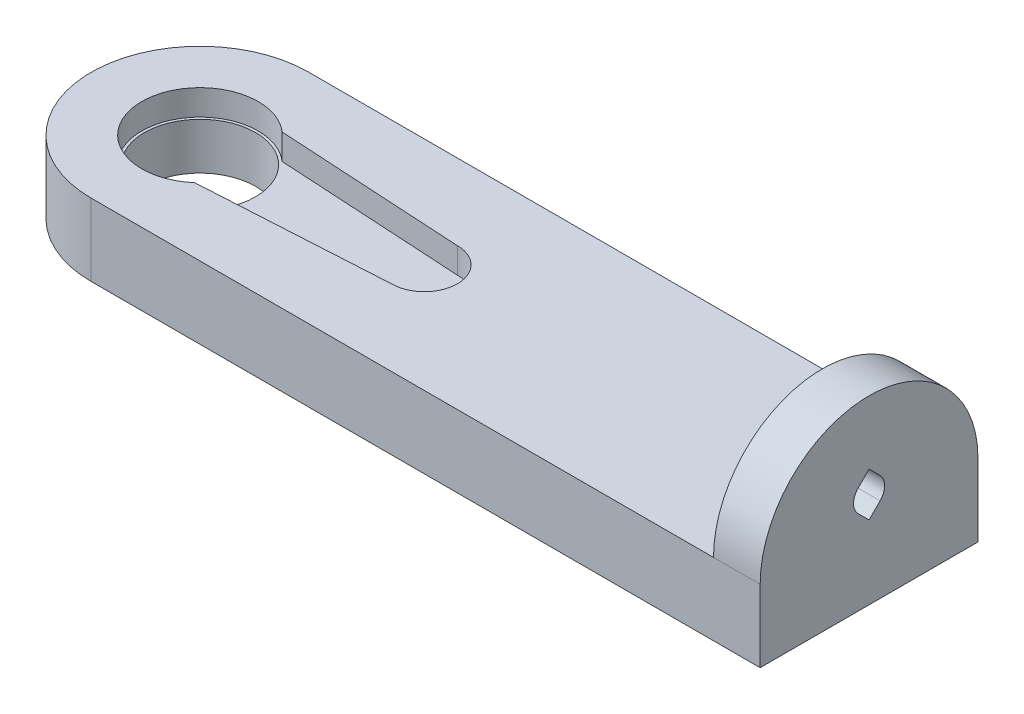
ISO-10303-21;
HEADER;
FILE_DESCRIPTION(('STEP AP214'),'2;1');
FILE_NAME('part.step','',(''),(''),'','','');
FILE_SCHEMA(('AUTOMOTIVE_DESIGN { 1 0 10303 214 1 1 1 1 }'));
ENDSEC;
DATA;
#1=APPLICATION_CONTEXT('core data for automotive mechanical design processes');
#2=APPLICATION_PROTOCOL_DEFINITION('international standard','automotive_design',2000,#1);
#3=PRODUCT_CONTEXT('',#1,'mechanical');
#4=PRODUCT('Part','Part','',(#3));
#5=PRODUCT_RELATED_PRODUCT_CATEGORY('part','',(#4));
#6=PRODUCT_DEFINITION_FORMATION('','',#4);
#7=PRODUCT_DEFINITION_CONTEXT('part definition',#1,'design');
#8=PRODUCT_DEFINITION('design','',#6,#7);
#9=PRODUCT_DEFINITION_SHAPE('','',#8);
#10=(LENGTH_UNIT() NAMED_UNIT(*) SI_UNIT(.MILLI.,.METRE.));
#11=(NAMED_UNIT(*) PLANE_ANGLE_UNIT() SI_UNIT($,.RADIAN.));
#12=(NAMED_UNIT(*) SI_UNIT($,.STERADIAN.) SOLID_ANGLE_UNIT());
#13=UNCERTAINTY_MEASURE_WITH_UNIT(LENGTH_MEASURE(1.E-05),#10,'distance_accuracy_value','');
#14=(GEOMETRIC_REPRESENTATION_CONTEXT(3) GLOBAL_UNCERTAINTY_ASSIGNED_CONTEXT((#13)) GLOBAL_UNIT_ASSIGNED_CONTEXT((#10,
#11,#12)) REPRESENTATION_CONTEXT('',''));
#15=CARTESIAN_POINT('',(0.,0.,0.));
#16=DIRECTION('',(0.,0.,1.));
#17=DIRECTION('',(1.,0.,0.));
#18=AXIS2_PLACEMENT_3D('',#15,#16,#17);
#19=CARTESIAN_POINT('',(40.,4.64,0.));
#20=DIRECTION('',(-1.,0.,0.));
#21=DIRECTION('',(0.,0.,1.));
#22=AXIS2_PLACEMENT_3D('',#19,#20,#21);
#23=PLANE('',#22);
#24=DIRECTION('',(0.,0.,-1.));
#25=VECTOR('',#24,1.);
#26=CARTESIAN_POINT('',(40.,4.64,7.));
#27=LINE('',#26,#25);
#28=CARTESIAN_POINT('',(40.,4.64,7.));
#29=VERTEX_POINT('',#28);
#30=CARTESIAN_POINT('',(40.,4.64,-7.));
#31=VERTEX_POINT('',#30);
#32=EDGE_CURVE('E275',#29,#31,#27,.T.);
#33=ORIENTED_EDGE('',*,*,#32,.F.);
#34=CARTESIAN_POINT('',(40.,4.64,0.));
#35=DIRECTION('',(1.,0.,0.));
#36=DIRECTION('',(0.,0.,1.));
#37=AXIS2_PLACEMENT_3D('',#34,#35,#36);
#38=CIRCLE('',#37,7.);
#39=EDGE_CURVE('E154',#31,#29,#38,.T.);
#40=ORIENTED_EDGE('',*,*,#39,.F.);
#41=EDGE_LOOP('',(#33,#40));
#42=FACE_BOUND('',#41,.T.);
#43=DIRECTION('',(0.,-0.707106781186548,-0.707106781186548));
#44=VECTOR('',#43,1.);
#45=CARTESIAN_POINT('',(40.,3.77710678118655,-3.77710678118655));
#46=LINE('',#45,#44);
#47=CARTESIAN_POINT('',(40.,7.55421356237309,0.));
#48=VERTEX_POINT('',#47);
#49=CARTESIAN_POINT('',(40.,6.84710678118655,-0.707106781186547));
#50=VERTEX_POINT('',#49);
#51=EDGE_CURVE('E165',#48,#50,#46,.T.);
#52=ORIENTED_EDGE('',*,*,#51,.F.);
#53=DIRECTION('',(0.,0.707106781186548,-0.707106781186547));
#54=VECTOR('',#53,1.);
#55=CARTESIAN_POINT('',(40.,3.77710678118655,3.77710678118655));
#56=LINE('',#55,#54);
#57=CARTESIAN_POINT('',(40.,6.84710678118655,0.707106781186549));
#58=VERTEX_POINT('',#57);
#59=EDGE_CURVE('E158',#58,#48,#56,.T.);
#60=ORIENTED_EDGE('',*,*,#59,.F.);
#61=CARTESIAN_POINT('',(40.,6.14,0.));
#62=DIRECTION('',(-1.,0.,0.));
#63=DIRECTION('',(0.,0.,1.));
#64=AXIS2_PLACEMENT_3D('',#61,#62,#63);
#65=CIRCLE('',#64,1.);
#66=CARTESIAN_POINT('',(40.,5.43289321881345,0.707106781186548));
#67=VERTEX_POINT('',#66);
#68=EDGE_CURVE('E146',#58,#67,#65,.F.);
#69=ORIENTED_EDGE('',*,*,#68,.T.);
#70=DIRECTION('',(0.,0.707106781186548,0.707106781186547));
#71=VECTOR('',#70,1.);
#72=CARTESIAN_POINT('',(40.,2.36289321881345,-2.36289321881345));
#73=LINE('',#72,#71);
#74=CARTESIAN_POINT('',(40.,4.72578643762691,0.));
#75=VERTEX_POINT('',#74);
#76=EDGE_CURVE('E450',#75,#67,#73,.T.);
#77=ORIENTED_EDGE('',*,*,#76,.F.);
#78=DIRECTION('',(0.,-0.707106781186548,0.707106781186548));
#79=VECTOR('',#78,1.);
#80=CARTESIAN_POINT('',(40.,2.36289321881345,2.36289321881345));
#81=LINE('',#80,#79);
#82=CARTESIAN_POINT('',(40.,5.43289321881345,-0.707106781186546));
#83=VERTEX_POINT('',#82);
#84=EDGE_CURVE('E454',#83,#75,#81,.T.);
#85=ORIENTED_EDGE('',*,*,#84,.F.);
#86=CARTESIAN_POINT('',(40.,6.14,0.));
#87=DIRECTION('',(-1.,0.,0.));
#88=DIRECTION('',(0.,0.,1.));
#89=AXIS2_PLACEMENT_3D('',#86,#87,#88);
#90=CIRCLE('',#89,1.);
#91=EDGE_CURVE('E172',#83,#50,#90,.F.);
#92=ORIENTED_EDGE('',*,*,#91,.T.);
#93=EDGE_LOOP('',(#52,#60,#69,#77,#85,#92));
#94=FACE_BOUND('',#93,.T.);
#95=ADVANCED_FACE('F39',(#42,#94),#23,.T.);
#96=CARTESIAN_POINT('',(43.,4.64,0.));
#97=DIRECTION('',(-1.,0.,0.));
#98=DIRECTION('',(0.,0.,1.));
#99=AXIS2_PLACEMENT_3D('',#96,#97,#98);
#100=PLANE('',#99);
#101=CARTESIAN_POINT('',(43.,4.64,0.));
#102=DIRECTION('',(1.,0.,0.));
#103=DIRECTION('',(0.,0.,1.));
#104=AXIS2_PLACEMENT_3D('',#101,#102,#103);
#105=CIRCLE('',#104,7.);
#106=CARTESIAN_POINT('',(43.,4.64,-7.));
#107=VERTEX_POINT('',#106);
#108=CARTESIAN_POINT('',(43.,4.64,7.));
#109=VERTEX_POINT('',#108);
#110=EDGE_CURVE('E203',#107,#109,#105,.T.);
#111=ORIENTED_EDGE('',*,*,#110,.T.);
#112=DIRECTION('',(0.,-1.,0.));
#113=VECTOR('',#112,1.);
#114=CARTESIAN_POINT('',(43.,4.64,7.));
#115=LINE('',#114,#113);
#116=CARTESIAN_POINT('',(43.,0.,7.));
#117=VERTEX_POINT('',#116);
#118=EDGE_CURVE('E207',#109,#117,#115,.T.);
#119=ORIENTED_EDGE('',*,*,#118,.T.);
#120=DIRECTION('',(0.,0.,-1.));
#121=VECTOR('',#120,1.);
#122=CARTESIAN_POINT('',(43.,0.,7.));
#123=LINE('',#122,#121);
#124=CARTESIAN_POINT('',(43.,0.,-7.));
#125=VERTEX_POINT('',#124);
#126=EDGE_CURVE('E211',#117,#125,#123,.T.);
#127=ORIENTED_EDGE('',*,*,#126,.T.);
#128=DIRECTION('',(0.,1.,0.));
#129=VECTOR('',#128,1.);
#130=CARTESIAN_POINT('',(43.,0.,-7.));
#131=LINE('',#130,#129);
#132=EDGE_CURVE('E215',#125,#107,#131,.T.);
#133=ORIENTED_EDGE('',*,*,#132,.T.);
#134=EDGE_LOOP('',(#111,#119,#127,#133));
#135=FACE_BOUND('',#134,.T.);
#136=DIRECTION('',(0.,0.707106781186548,-0.707106781186547));
#137=VECTOR('',#136,1.);
#138=CARTESIAN_POINT('',(43.,3.77710678118655,3.77710678118655));
#139=LINE('',#138,#137);
#140=CARTESIAN_POINT('',(43.,6.84710678118655,0.707106781186549));
#141=VERTEX_POINT('',#140);
#142=CARTESIAN_POINT('',(43.,7.55421356237309,0.));
#143=VERTEX_POINT('',#142);
#144=EDGE_CURVE('E63',#141,#143,#139,.T.);
#145=ORIENTED_EDGE('',*,*,#144,.T.);
#146=DIRECTION('',(0.,-0.707106781186548,-0.707106781186548));
#147=VECTOR('',#146,1.);
#148=CARTESIAN_POINT('',(43.,3.77710678118655,-3.77710678118655));
#149=LINE('',#148,#147);
#150=CARTESIAN_POINT('',(43.,6.84710678118655,-0.707106781186546));
#151=VERTEX_POINT('',#150);
#152=EDGE_CURVE('E161',#143,#151,#149,.T.);
#153=ORIENTED_EDGE('',*,*,#152,.T.);
#154=CARTESIAN_POINT('',(43.,6.14,0.));
#155=DIRECTION('',(1.,0.,0.));
#156=DIRECTION('',(0.,0.,-1.));
#157=AXIS2_PLACEMENT_3D('',#154,#155,#156);
#158=CIRCLE('',#157,1.);
#159=CARTESIAN_POINT('',(43.,5.43289321881345,-0.707106781186547));
#160=VERTEX_POINT('',#159);
#161=EDGE_CURVE('E179',#160,#151,#158,.T.);
#162=ORIENTED_EDGE('',*,*,#161,.F.);
#163=DIRECTION('',(0.,-0.707106781186548,0.707106781186548));
#164=VECTOR('',#163,1.);
#165=CARTESIAN_POINT('',(43.,2.36289321881345,2.36289321881345));
#166=LINE('',#165,#164);
#167=CARTESIAN_POINT('',(43.,4.72578643762691,0.));
#168=VERTEX_POINT('',#167);
#169=EDGE_CURVE('E183',#160,#168,#166,.T.);
#170=ORIENTED_EDGE('',*,*,#169,.T.);
#171=DIRECTION('',(0.,0.707106781186548,0.707106781186547));
#172=VECTOR('',#171,1.);
#173=CARTESIAN_POINT('',(43.,2.36289321881345,-2.36289321881345));
#174=LINE('',#173,#172);
#175=CARTESIAN_POINT('',(43.,5.43289321881345,0.707106781186548));
#176=VERTEX_POINT('',#175);
#177=EDGE_CURVE('E178',#168,#176,#174,.T.);
#178=ORIENTED_EDGE('',*,*,#177,.T.);
#179=EDGE_CURVE('E170',#141,#176,#158,.T.);
#180=ORIENTED_EDGE('',*,*,#179,.F.);
#181=EDGE_LOOP('',(#145,#153,#162,#170,#178,#180));
#182=FACE_BOUND('',#181,.T.);
#183=ADVANCED_FACE('F328',(#135,#182),#100,.F.);
#184=CARTESIAN_POINT('',(0.,3.,0.));
#185=DIRECTION('',(0.,1.,0.));
#186=DIRECTION('',(0.,0.,1.));
#187=AXIS2_PLACEMENT_3D('',#184,#185,#186);
#188=PLANE('',#187);
#189=CARTESIAN_POINT('',(0.,3.,0.));
#190=DIRECTION('',(0.,1.,0.));
#191=DIRECTION('',(0.,0.,1.));
#192=AXIS2_PLACEMENT_3D('',#189,#190,#191);
#193=CIRCLE('',#192,3.575);
#194=CARTESIAN_POINT('',(0.,3.,3.575));
#195=VERTEX_POINT('',#194);
#196=EDGE_CURVE('E291',#195,#195,#193,.T.);
#197=ORIENTED_EDGE('',*,*,#196,.F.);
#198=EDGE_LOOP('',(#197));
#199=FACE_BOUND('',#198,.T.);
#200=DIRECTION('',(0.998310081629833,0.,-0.0581117967045877));
#201=VECTOR('',#200,1.);
#202=CARTESIAN_POINT('',(2.46852452254572,3.,2.81627620832731));
#203=LINE('',#202,#201);
#204=CARTESIAN_POINT('',(2.46852452254572,3.,2.81627620832731));
#205=VERTEX_POINT('',#204);
#206=CARTESIAN_POINT('',(14.4300468804629,3.,2.1199939926796));
#207=VERTEX_POINT('',#206);
#208=EDGE_CURVE('E234',#205,#207,#203,.T.);
#209=ORIENTED_EDGE('',*,*,#208,.T.);
#210=CARTESIAN_POINT('',(14.425,3.,0.));
#211=DIRECTION('',(0.,1.,0.));
#212=DIRECTION('',(0.,0.,1.));
#213=AXIS2_PLACEMENT_3D('',#210,#211,#212);
#214=CIRCLE('',#213,2.12);
#215=CARTESIAN_POINT('',(14.4300468804628,3.,-2.1199939926796));
#216=VERTEX_POINT('',#215);
#217=EDGE_CURVE('E229',#207,#216,#214,.T.);
#218=ORIENTED_EDGE('',*,*,#217,.T.);
#219=DIRECTION('',(-0.998310081629833,0.,-0.0581117967045882));
#220=VECTOR('',#219,1.);
#221=CARTESIAN_POINT('',(14.4300468804628,3.,-2.1199939926796));
#222=LINE('',#221,#220);
#223=CARTESIAN_POINT('',(2.46852452254572,3.,-2.81627620832731));
#224=VERTEX_POINT('',#223);
#225=EDGE_CURVE('E248',#216,#224,#222,.T.);
#226=ORIENTED_EDGE('',*,*,#225,.T.);
#227=CARTESIAN_POINT('',(0.,3.,0.));
#228=DIRECTION('',(0.,1.,0.));
#229=DIRECTION('',(0.,0.,-1.));
#230=AXIS2_PLACEMENT_3D('',#227,#228,#229);
#231=CIRCLE('',#230,3.745);
#232=EDGE_CURVE('E252',#224,#205,#231,.T.);
#233=ORIENTED_EDGE('',*,*,#232,.T.);
#234=EDGE_LOOP('',(#209,#218,#226,#233));
#235=FACE_BOUND('',#234,.T.);
#236=ADVANCED_FACE('F336',(#199,#235),#188,.T.);
#237=CARTESIAN_POINT('',(0.,3.,0.));
#238=DIRECTION('',(0.,-1.,0.));
#239=DIRECTION('',(0.,0.,-1.));
#240=AXIS2_PLACEMENT_3D('',#237,#238,#239);
#241=CYLINDRICAL_SURFACE('',#240,7.);
#242=CARTESIAN_POINT('',(0.,0.,0.));
#243=DIRECTION('',(0.,1.,0.));
#244=DIRECTION('',(0.,0.,1.));
#245=AXIS2_PLACEMENT_3D('',#242,#243,#244);
#246=CIRCLE('',#245,7.);
#247=CARTESIAN_POINT('',(0.,0.,-7.));
#248=VERTEX_POINT('',#247);
#249=CARTESIAN_POINT('',(0.,0.,7.));
#250=VERTEX_POINT('',#249);
#251=EDGE_CURVE('E295',#248,#250,#246,.T.);
#252=ORIENTED_EDGE('',*,*,#251,.T.);
#253=DIRECTION('',(0.,-1.,0.));
#254=VECTOR('',#253,1.);
#255=CARTESIAN_POINT('',(0.,3.,7.));
#256=LINE('',#255,#254);
#257=CARTESIAN_POINT('',(0.,4.64,7.));
#258=VERTEX_POINT('',#257);
#259=EDGE_CURVE('E11',#258,#250,#256,.T.);
#260=ORIENTED_EDGE('',*,*,#259,.F.);
#261=CARTESIAN_POINT('',(0.,4.64,0.));
#262=DIRECTION('',(0.,1.,0.));
#263=DIRECTION('',(0.,0.,1.));
#264=AXIS2_PLACEMENT_3D('',#261,#262,#263);
#265=CIRCLE('',#264,7.);
#266=CARTESIAN_POINT('',(0.,4.64,-7.));
#267=VERTEX_POINT('',#266);
#268=EDGE_CURVE('E283',#267,#258,#265,.T.);
#269=ORIENTED_EDGE('',*,*,#268,.F.);
#270=DIRECTION('',(0.,-1.,0.));
#271=VECTOR('',#270,1.);
#272=CARTESIAN_POINT('',(0.,3.,-7.));
#273=LINE('',#272,#271);
#274=EDGE_CURVE('E48',#267,#248,#273,.T.);
#275=ORIENTED_EDGE('',*,*,#274,.T.);
#276=EDGE_LOOP('',(#252,#260,#269,#275));
#277=FACE_BOUND('',#276,.T.);
#278=ADVANCED_FACE('F41',(#277),#241,.T.);
#279=CARTESIAN_POINT('',(0.,3.,7.));
#280=DIRECTION('',(0.,0.,-1.));
#281=DIRECTION('',(-1.,0.,0.));
#282=AXIS2_PLACEMENT_3D('',#279,#280,#281);
#283=PLANE('',#282);
#284=DIRECTION('',(1.,0.,0.));
#285=VECTOR('',#284,1.);
#286=CARTESIAN_POINT('',(0.,0.,7.));
#287=LINE('',#286,#285);
#288=EDGE_CURVE('E299',#250,#117,#287,.T.);
#289=ORIENTED_EDGE('',*,*,#288,.T.);
#290=ORIENTED_EDGE('',*,*,#118,.F.);
#291=DIRECTION('',(-1.,0.,0.));
#292=VECTOR('',#291,1.);
#293=CARTESIAN_POINT('',(43.,4.64,7.));
#294=LINE('',#293,#292);
#295=EDGE_CURVE('E225',#109,#29,#294,.T.);
#296=ORIENTED_EDGE('',*,*,#295,.T.);
#297=DIRECTION('',(1.,0.,0.));
#298=VECTOR('',#297,1.);
#299=CARTESIAN_POINT('',(0.,4.64,7.));
#300=LINE('',#299,#298);
#301=EDGE_CURVE('E271',#258,#29,#300,.T.);
#302=ORIENTED_EDGE('',*,*,#301,.F.);
#303=ORIENTED_EDGE('',*,*,#259,.T.);
#304=EDGE_LOOP('',(#289,#290,#296,#302,#303));
#305=FACE_BOUND('',#304,.T.);
#306=ADVANCED_FACE('F316',(#305),#283,.F.);
#307=CARTESIAN_POINT('',(0.,3.,-7.));
#308=DIRECTION('',(0.,0.,1.));
#309=DIRECTION('',(1.,0.,0.));
#310=AXIS2_PLACEMENT_3D('',#307,#308,#309);
#311=PLANE('',#310);
#312=DIRECTION('',(-1.,0.,0.));
#313=VECTOR('',#312,1.);
#314=CARTESIAN_POINT('',(0.,0.,-7.));
#315=LINE('',#314,#313);
#316=EDGE_CURVE('E302',#125,#248,#315,.T.);
#317=ORIENTED_EDGE('',*,*,#316,.T.);
#318=ORIENTED_EDGE('',*,*,#274,.F.);
#319=DIRECTION('',(-1.,0.,0.));
#320=VECTOR('',#319,1.);
#321=CARTESIAN_POINT('',(40.,4.64,-7.));
#322=LINE('',#321,#320);
#323=EDGE_CURVE('E279',#31,#267,#322,.T.);
#324=ORIENTED_EDGE('',*,*,#323,.F.);
#325=DIRECTION('',(-1.,0.,0.));
#326=VECTOR('',#325,1.);
#327=CARTESIAN_POINT('',(43.,4.64,-7.));
#328=LINE('',#327,#326);
#329=EDGE_CURVE('E218',#107,#31,#328,.T.);
#330=ORIENTED_EDGE('',*,*,#329,.F.);
#331=ORIENTED_EDGE('',*,*,#132,.F.);
#332=EDGE_LOOP('',(#317,#318,#324,#330,#331));
#333=FACE_BOUND('',#332,.T.);
#334=ADVANCED_FACE('F321',(#333),#311,.F.);
#335=CARTESIAN_POINT('',(0.,0.,0.));
#336=DIRECTION('',(0.,1.,0.));
#337=DIRECTION('',(0.,0.,1.));
#338=AXIS2_PLACEMENT_3D('',#335,#336,#337);
#339=PLANE('',#338);
#340=CARTESIAN_POINT('',(0.,0.,0.));
#341=DIRECTION('',(0.,-1.,0.));
#342=DIRECTION('',(0.,0.,-1.));
#343=AXIS2_PLACEMENT_3D('',#340,#341,#342);
#344=CIRCLE('',#343,3.575);
#345=CARTESIAN_POINT('',(0.,0.,-3.575));
#346=VERTEX_POINT('',#345);
#347=EDGE_CURVE('E287',#346,#346,#344,.T.);
#348=ORIENTED_EDGE('',*,*,#347,.F.);
#349=EDGE_LOOP('',(#348));
#350=FACE_BOUND('',#349,.T.);
#351=ORIENTED_EDGE('',*,*,#251,.F.);
#352=ORIENTED_EDGE('',*,*,#316,.F.);
#353=ORIENTED_EDGE('',*,*,#126,.F.);
#354=ORIENTED_EDGE('',*,*,#288,.F.);
#355=EDGE_LOOP('',(#351,#352,#353,#354));
#356=FACE_BOUND('',#355,.T.);
#357=ADVANCED_FACE('F312',(#350,#356),#339,.F.);
#358=CARTESIAN_POINT('',(0.,3.95,0.));
#359=DIRECTION('',(0.,-1.,0.));
#360=DIRECTION('',(0.,0.,-1.));
#361=AXIS2_PLACEMENT_3D('',#358,#359,#360);
#362=CYLINDRICAL_SURFACE('',#361,3.575);
#363=ORIENTED_EDGE('',*,*,#196,.T.);
#364=EDGE_LOOP('',(#363));
#365=FACE_BOUND('',#364,.T.);
#366=ORIENTED_EDGE('',*,*,#347,.T.);
#367=EDGE_LOOP('',(#366));
#368=FACE_BOUND('',#367,.T.);
#369=ADVANCED_FACE('F360',(#365,#368),#362,.F.);
#370=CARTESIAN_POINT('',(0.,4.64,0.));
#371=DIRECTION('',(0.,1.,0.));
#372=DIRECTION('',(0.,0.,1.));
#373=AXIS2_PLACEMENT_3D('',#370,#371,#372);
#374=PLANE('',#373);
#375=ORIENTED_EDGE('',*,*,#301,.T.);
#376=ORIENTED_EDGE('',*,*,#32,.T.);
#377=ORIENTED_EDGE('',*,*,#323,.T.);
#378=ORIENTED_EDGE('',*,*,#268,.T.);
#379=EDGE_LOOP('',(#375,#376,#377,#378));
#380=FACE_BOUND('',#379,.T.);
#381=DIRECTION('',(-0.998310081629833,0.,-0.0581117967045882));
#382=VECTOR('',#381,1.);
#383=CARTESIAN_POINT('',(14.4300468804628,4.64,-2.1199939926796));
#384=LINE('',#383,#382);
#385=CARTESIAN_POINT('',(14.4300468804628,4.64,-2.1199939926796));
#386=VERTEX_POINT('',#385);
#387=CARTESIAN_POINT('',(2.46852452254572,4.64,-2.81627620832731));
#388=VERTEX_POINT('',#387);
#389=EDGE_CURVE('E233',#386,#388,#384,.T.);
#390=ORIENTED_EDGE('',*,*,#389,.F.);
#391=CARTESIAN_POINT('',(14.425,4.64,0.));
#392=DIRECTION('',(0.,1.,0.));
#393=DIRECTION('',(0.,0.,1.));
#394=AXIS2_PLACEMENT_3D('',#391,#392,#393);
#395=CIRCLE('',#394,2.12);
#396=CARTESIAN_POINT('',(14.4300468804629,4.64,2.1199939926796));
#397=VERTEX_POINT('',#396);
#398=EDGE_CURVE('E230',#397,#386,#395,.T.);
#399=ORIENTED_EDGE('',*,*,#398,.F.);
#400=DIRECTION('',(0.998310081629833,0.,-0.0581117967045877));
#401=VECTOR('',#400,1.);
#402=CARTESIAN_POINT('',(2.46852452254572,4.64,2.81627620832731));
#403=LINE('',#402,#401);
#404=CARTESIAN_POINT('',(2.46852452254572,4.64,2.81627620832731));
#405=VERTEX_POINT('',#404);
#406=EDGE_CURVE('E241',#405,#397,#403,.T.);
#407=ORIENTED_EDGE('',*,*,#406,.F.);
#408=CARTESIAN_POINT('',(0.,4.64,0.));
#409=DIRECTION('',(0.,1.,0.));
#410=DIRECTION('',(0.,0.,-1.));
#411=AXIS2_PLACEMENT_3D('',#408,#409,#410);
#412=CIRCLE('',#411,3.745);
#413=EDGE_CURVE('E237',#388,#405,#412,.T.);
#414=ORIENTED_EDGE('',*,*,#413,.F.);
#415=EDGE_LOOP('',(#390,#399,#407,#414));
#416=FACE_BOUND('',#415,.T.);
#417=ADVANCED_FACE('F318',(#380,#416),#374,.T.);
#418=CARTESIAN_POINT('',(14.425,4.64,0.));
#419=DIRECTION('',(0.,-1.,0.));
#420=DIRECTION('',(0.,0.,-1.));
#421=AXIS2_PLACEMENT_3D('',#418,#419,#420);
#422=CYLINDRICAL_SURFACE('',#421,2.12);
#423=ORIENTED_EDGE('',*,*,#217,.F.);
#424=DIRECTION('',(0.,-1.,0.));
#425=VECTOR('',#424,1.);
#426=CARTESIAN_POINT('',(14.4300468804629,4.64,2.1199939926796));
#427=LINE('',#426,#425);
#428=EDGE_CURVE('E244',#397,#207,#427,.T.);
#429=ORIENTED_EDGE('',*,*,#428,.F.);
#430=ORIENTED_EDGE('',*,*,#398,.T.);
#431=DIRECTION('',(0.,-1.,0.));
#432=VECTOR('',#431,1.);
#433=CARTESIAN_POINT('',(14.4300468804628,4.64,-2.1199939926796));
#434=LINE('',#433,#432);
#435=EDGE_CURVE('E267',#386,#216,#434,.T.);
#436=ORIENTED_EDGE('',*,*,#435,.T.);
#437=EDGE_LOOP('',(#423,#429,#430,#436));
#438=FACE_BOUND('',#437,.T.);
#439=ADVANCED_FACE('F353',(#438),#422,.F.);
#440=CARTESIAN_POINT('',(14.4300468804628,4.64,-2.1199939926796));
#441=DIRECTION('',(-0.0581117967045882,0.,0.998310081629833));
#442=DIRECTION('',(0.998310081629833,0.,0.0581117967045882));
#443=AXIS2_PLACEMENT_3D('',#440,#441,#442);
#444=PLANE('',#443);
#445=ORIENTED_EDGE('',*,*,#225,.F.);
#446=ORIENTED_EDGE('',*,*,#435,.F.);
#447=ORIENTED_EDGE('',*,*,#389,.T.);
#448=DIRECTION('',(0.,-1.,0.));
#449=VECTOR('',#448,1.);
#450=CARTESIAN_POINT('',(2.46852452254572,4.64,-2.81627620832731));
#451=LINE('',#450,#449);
#452=EDGE_CURVE('E264',#388,#224,#451,.T.);
#453=ORIENTED_EDGE('',*,*,#452,.T.);
#454=EDGE_LOOP('',(#445,#446,#447,#453));
#455=FACE_BOUND('',#454,.T.);
#456=ADVANCED_FACE('F349',(#455),#444,.T.);
#457=CARTESIAN_POINT('',(0.,4.64,0.));
#458=DIRECTION('',(0.,-1.,0.));
#459=DIRECTION('',(0.,0.,-1.));
#460=AXIS2_PLACEMENT_3D('',#457,#458,#459);
#461=CYLINDRICAL_SURFACE('',#460,3.745);
#462=ORIENTED_EDGE('',*,*,#232,.F.);
#463=ORIENTED_EDGE('',*,*,#452,.F.);
#464=ORIENTED_EDGE('',*,*,#413,.T.);
#465=DIRECTION('',(0.,-1.,0.));
#466=VECTOR('',#465,1.);
#467=CARTESIAN_POINT('',(2.46852452254572,4.64,2.81627620832731));
#468=LINE('',#467,#466);
#469=EDGE_CURVE('E261',#405,#205,#468,.T.);
#470=ORIENTED_EDGE('',*,*,#469,.T.);
#471=EDGE_LOOP('',(#462,#463,#464,#470));
#472=FACE_BOUND('',#471,.T.);
#473=ADVANCED_FACE('F345',(#472),#461,.F.);
#474=CARTESIAN_POINT('',(2.46852452254572,4.64,2.81627620832731));
#475=DIRECTION('',(-0.0581117967045877,0.,-0.998310081629833));
#476=DIRECTION('',(-0.998310081629834,0.,0.0581117967045878));
#477=AXIS2_PLACEMENT_3D('',#474,#475,#476);
#478=PLANE('',#477);
#479=ORIENTED_EDGE('',*,*,#208,.F.);
#480=ORIENTED_EDGE('',*,*,#469,.F.);
#481=ORIENTED_EDGE('',*,*,#406,.T.);
#482=ORIENTED_EDGE('',*,*,#428,.T.);
#483=EDGE_LOOP('',(#479,#480,#481,#482));
#484=FACE_BOUND('',#483,.T.);
#485=ADVANCED_FACE('F342',(#484),#478,.T.);
#486=CARTESIAN_POINT('',(43.,4.64,0.));
#487=DIRECTION('',(-1.,0.,0.));
#488=DIRECTION('',(0.,0.,1.));
#489=AXIS2_PLACEMENT_3D('',#486,#487,#488);
#490=CYLINDRICAL_SURFACE('',#489,7.);
#491=ORIENTED_EDGE('',*,*,#39,.T.);
#492=ORIENTED_EDGE('',*,*,#295,.F.);
#493=ORIENTED_EDGE('',*,*,#110,.F.);
#494=ORIENTED_EDGE('',*,*,#329,.T.);
#495=EDGE_LOOP('',(#491,#492,#493,#494));
#496=FACE_BOUND('',#495,.T.);
#497=ADVANCED_FACE('F326',(#496),#490,.T.);
#498=CARTESIAN_POINT('',(-7.001,3.77710678118655,3.77710678118655));
#499=DIRECTION('',(0.,-0.707106781186548,-0.707106781186548));
#500=DIRECTION('',(0.,0.707106781186548,-0.707106781186547));
#501=AXIS2_PLACEMENT_3D('',#498,#499,#500);
#502=PLANE('',#501);
#503=ORIENTED_EDGE('',*,*,#59,.T.);
#504=DIRECTION('',(1.,0.,0.));
#505=VECTOR('',#504,1.);
#506=CARTESIAN_POINT('',(-7.001,7.55421356237309,0.));
#507=LINE('',#506,#505);
#508=EDGE_CURVE('E155',#48,#143,#507,.T.);
#509=ORIENTED_EDGE('',*,*,#508,.T.);
#510=ORIENTED_EDGE('',*,*,#144,.F.);
#511=DIRECTION('',(1.,0.,0.));
#512=VECTOR('',#511,1.);
#513=CARTESIAN_POINT('',(-7.001,6.84710678118655,0.707106781186548));
#514=LINE('',#513,#512);
#515=EDGE_CURVE('E148',#58,#141,#514,.T.);
#516=ORIENTED_EDGE('',*,*,#515,.F.);
#517=EDGE_LOOP('',(#503,#509,#510,#516));
#518=FACE_BOUND('',#517,.T.);
#519=ADVANCED_FACE('F157',(#518),#502,.T.);
#520=CARTESIAN_POINT('',(-7.001,3.77710678118655,-3.77710678118655));
#521=DIRECTION('',(0.,-0.707106781186548,0.707106781186548));
#522=DIRECTION('',(0.,-0.707106781186548,-0.707106781186548));
#523=AXIS2_PLACEMENT_3D('',#520,#521,#522);
#524=PLANE('',#523);
#525=ORIENTED_EDGE('',*,*,#51,.T.);
#526=DIRECTION('',(1.,0.,0.));
#527=VECTOR('',#526,1.);
#528=CARTESIAN_POINT('',(-7.001,6.84710678118655,-0.707106781186546));
#529=LINE('',#528,#527);
#530=EDGE_CURVE('E192',#50,#151,#529,.T.);
#531=ORIENTED_EDGE('',*,*,#530,.T.);
#532=ORIENTED_EDGE('',*,*,#152,.F.);
#533=ORIENTED_EDGE('',*,*,#508,.F.);
#534=EDGE_LOOP('',(#525,#531,#532,#533));
#535=FACE_BOUND('',#534,.T.);
#536=ADVANCED_FACE('F400',(#535),#524,.T.);
#537=CARTESIAN_POINT('',(-7.001,6.14,0.));
#538=DIRECTION('',(1.,0.,0.));
#539=DIRECTION('',(0.,0.,-1.));
#540=AXIS2_PLACEMENT_3D('',#537,#538,#539);
#541=CYLINDRICAL_SURFACE('',#540,1.);
#542=DIRECTION('',(1.,0.,0.));
#543=VECTOR('',#542,1.);
#544=CARTESIAN_POINT('',(-7.001,5.43289321881345,-0.707106781186547));
#545=LINE('',#544,#543);
#546=EDGE_CURVE('E195',#83,#160,#545,.T.);
#547=ORIENTED_EDGE('',*,*,#546,.T.);
#548=ORIENTED_EDGE('',*,*,#161,.T.);
#549=ORIENTED_EDGE('',*,*,#530,.F.);
#550=ORIENTED_EDGE('',*,*,#91,.F.);
#551=EDGE_LOOP('',(#547,#548,#549,#550));
#552=FACE_BOUND('',#551,.T.);
#553=ADVANCED_FACE('F408',(#552),#541,.F.);
#554=CARTESIAN_POINT('',(-7.001,2.36289321881345,2.36289321881345));
#555=DIRECTION('',(0.,0.707106781186548,0.707106781186548));
#556=DIRECTION('',(0.,-0.707106781186548,0.707106781186548));
#557=AXIS2_PLACEMENT_3D('',#554,#555,#556);
#558=PLANE('',#557);
#559=ORIENTED_EDGE('',*,*,#84,.T.);
#560=DIRECTION('',(1.,0.,0.));
#561=VECTOR('',#560,1.);
#562=CARTESIAN_POINT('',(-7.001,4.72578643762691,0.));
#563=LINE('',#562,#561);
#564=EDGE_CURVE('E198',#75,#168,#563,.T.);
#565=ORIENTED_EDGE('',*,*,#564,.T.);
#566=ORIENTED_EDGE('',*,*,#169,.F.);
#567=ORIENTED_EDGE('',*,*,#546,.F.);
#568=EDGE_LOOP('',(#559,#565,#566,#567));
#569=FACE_BOUND('',#568,.T.);
#570=ADVANCED_FACE('F418',(#569),#558,.T.);
#571=CARTESIAN_POINT('',(-7.001,2.36289321881345,-2.36289321881345));
#572=DIRECTION('',(0.,0.707106781186548,-0.707106781186548));
#573=DIRECTION('',(0.,0.707106781186548,0.707106781186547));
#574=AXIS2_PLACEMENT_3D('',#571,#572,#573);
#575=PLANE('',#574);
#576=ORIENTED_EDGE('',*,*,#76,.T.);
#577=DIRECTION('',(1.,0.,0.));
#578=VECTOR('',#577,1.);
#579=CARTESIAN_POINT('',(-7.001,5.43289321881345,0.707106781186548));
#580=LINE('',#579,#578);
#581=EDGE_CURVE('E55',#67,#176,#580,.T.);
#582=ORIENTED_EDGE('',*,*,#581,.T.);
#583=ORIENTED_EDGE('',*,*,#177,.F.);
#584=ORIENTED_EDGE('',*,*,#564,.F.);
#585=EDGE_LOOP('',(#576,#582,#583,#584));
#586=FACE_BOUND('',#585,.T.);
#587=ADVANCED_FACE('F428',(#586),#575,.T.);
#588=ORIENTED_EDGE('',*,*,#515,.T.);
#589=ORIENTED_EDGE('',*,*,#179,.T.);
#590=ORIENTED_EDGE('',*,*,#581,.F.);
#591=ORIENTED_EDGE('',*,*,#68,.F.);
#592=EDGE_LOOP('',(#588,#589,#590,#591));
#593=FACE_BOUND('',#592,.T.);
#594=ADVANCED_FACE('F147',(#593),#541,.F.);
#595=CLOSED_SHELL('',(#95,#183,#236,#278,#306,#334,#357,#369,#417,#439,#456,#473,#485,#497,#519,
#536,#553,#570,#587,#594));
#596=MANIFOLD_SOLID_BREP('B2',#595);
#597=ADVANCED_BREP_SHAPE_REPRESENTATION('',(#18,#596),#14);
#598=SHAPE_DEFINITION_REPRESENTATION(#9,#597);
ENDSEC;
END-ISO-10303-21;
